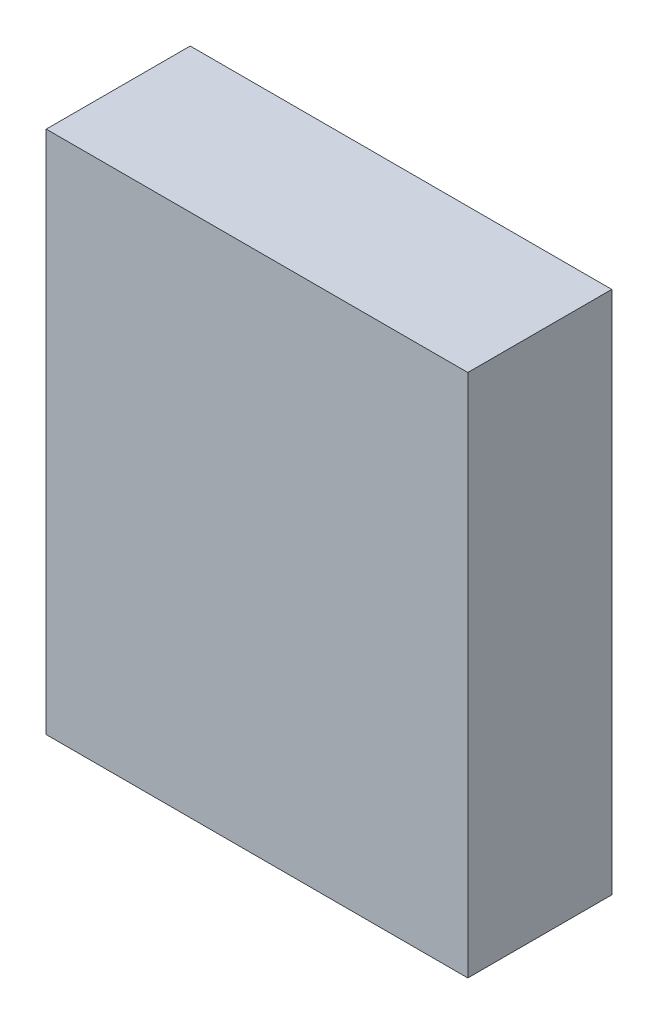
ISO-10303-21;
HEADER;
FILE_DESCRIPTION(('STEP AP214'),'2;1');
FILE_NAME('part.step','',(''),(''),'','','');
FILE_SCHEMA(('AUTOMOTIVE_DESIGN { 1 0 10303 214 1 1 1 1 }'));
ENDSEC;
DATA;
#1=APPLICATION_CONTEXT('core data for automotive mechanical design processes');
#2=APPLICATION_PROTOCOL_DEFINITION('international standard','automotive_design',2000,#1);
#3=PRODUCT_CONTEXT('',#1,'mechanical');
#4=PRODUCT('Part','Part','',(#3));
#5=PRODUCT_RELATED_PRODUCT_CATEGORY('part','',(#4));
#6=PRODUCT_DEFINITION_FORMATION('','',#4);
#7=PRODUCT_DEFINITION_CONTEXT('part definition',#1,'design');
#8=PRODUCT_DEFINITION('design','',#6,#7);
#9=PRODUCT_DEFINITION_SHAPE('','',#8);
#10=(LENGTH_UNIT() NAMED_UNIT(*) SI_UNIT(.MILLI.,.METRE.));
#11=(NAMED_UNIT(*) PLANE_ANGLE_UNIT() SI_UNIT($,.RADIAN.));
#12=(NAMED_UNIT(*) SI_UNIT($,.STERADIAN.) SOLID_ANGLE_UNIT());
#13=UNCERTAINTY_MEASURE_WITH_UNIT(LENGTH_MEASURE(1.E-05),#10,'distance_accuracy_value','');
#14=(GEOMETRIC_REPRESENTATION_CONTEXT(3) GLOBAL_UNCERTAINTY_ASSIGNED_CONTEXT((#13)) GLOBAL_UNIT_ASSIGNED_CONTEXT((#10,
#11,#12)) REPRESENTATION_CONTEXT('',''));
#15=CARTESIAN_POINT('',(0.,0.,0.));
#16=DIRECTION('',(0.,0.,1.));
#17=DIRECTION('',(1.,0.,0.));
#18=AXIS2_PLACEMENT_3D('',#15,#16,#17);
#19=CARTESIAN_POINT('',(205.,-255.,140.));
#20=DIRECTION('',(-1.,0.,0.));
#21=DIRECTION('',(0.,0.,1.));
#22=AXIS2_PLACEMENT_3D('',#19,#20,#21);
#23=PLANE('',#22);
#24=DIRECTION('',(0.,1.,0.));
#25=VECTOR('',#24,1.);
#26=CARTESIAN_POINT('',(205.,-255.,0.));
#27=LINE('',#26,#25);
#28=CARTESIAN_POINT('',(205.,-255.,0.));
#29=VERTEX_POINT('',#28);
#30=CARTESIAN_POINT('',(205.,255.,0.));
#31=VERTEX_POINT('',#30);
#32=EDGE_CURVE('E113',#29,#31,#27,.T.);
#33=ORIENTED_EDGE('',*,*,#32,.T.);
#34=DIRECTION('',(0.,0.,-1.));
#35=VECTOR('',#34,1.);
#36=CARTESIAN_POINT('',(205.,255.,140.));
#37=LINE('',#36,#35);
#38=CARTESIAN_POINT('',(205.,255.,140.));
#39=VERTEX_POINT('',#38);
#40=EDGE_CURVE('E11',#39,#31,#37,.T.);
#41=ORIENTED_EDGE('',*,*,#40,.F.);
#42=DIRECTION('',(0.,1.,0.));
#43=VECTOR('',#42,1.);
#44=CARTESIAN_POINT('',(205.,-255.,140.));
#45=LINE('',#44,#43);
#46=CARTESIAN_POINT('',(205.,-255.,140.));
#47=VERTEX_POINT('',#46);
#48=EDGE_CURVE('E97',#47,#39,#45,.T.);
#49=ORIENTED_EDGE('',*,*,#48,.F.);
#50=DIRECTION('',(0.,0.,-1.));
#51=VECTOR('',#50,1.);
#52=CARTESIAN_POINT('',(205.,-255.,140.));
#53=LINE('',#52,#51);
#54=EDGE_CURVE('E109',#47,#29,#53,.T.);
#55=ORIENTED_EDGE('',*,*,#54,.T.);
#56=EDGE_LOOP('',(#33,#41,#49,#55));
#57=FACE_BOUND('',#56,.T.);
#58=ADVANCED_FACE('F45',(#57),#23,.F.);
#59=CARTESIAN_POINT('',(-205.,255.,140.));
#60=DIRECTION('',(0.,-1.,0.));
#61=DIRECTION('',(0.,0.,-1.));
#62=AXIS2_PLACEMENT_3D('',#59,#60,#61);
#63=PLANE('',#62);
#64=DIRECTION('',(-1.,0.,0.));
#65=VECTOR('',#64,1.);
#66=CARTESIAN_POINT('',(-205.,255.,0.));
#67=LINE('',#66,#65);
#68=CARTESIAN_POINT('',(-205.,255.,0.));
#69=VERTEX_POINT('',#68);
#70=EDGE_CURVE('E102',#31,#69,#67,.T.);
#71=ORIENTED_EDGE('',*,*,#70,.T.);
#72=DIRECTION('',(0.,0.,-1.));
#73=VECTOR('',#72,1.);
#74=CARTESIAN_POINT('',(-205.,255.,140.));
#75=LINE('',#74,#73);
#76=CARTESIAN_POINT('',(-205.,255.,140.));
#77=VERTEX_POINT('',#76);
#78=EDGE_CURVE('E54',#77,#69,#75,.T.);
#79=ORIENTED_EDGE('',*,*,#78,.F.);
#80=DIRECTION('',(-1.,0.,0.));
#81=VECTOR('',#80,1.);
#82=CARTESIAN_POINT('',(-205.,255.,140.));
#83=LINE('',#82,#81);
#84=EDGE_CURVE('E92',#39,#77,#83,.T.);
#85=ORIENTED_EDGE('',*,*,#84,.F.);
#86=ORIENTED_EDGE('',*,*,#40,.T.);
#87=EDGE_LOOP('',(#71,#79,#85,#86));
#88=FACE_BOUND('',#87,.T.);
#89=ADVANCED_FACE('F101',(#88),#63,.F.);
#90=CARTESIAN_POINT('',(-205.,-255.,140.));
#91=DIRECTION('',(1.,0.,0.));
#92=DIRECTION('',(0.,0.,-1.));
#93=AXIS2_PLACEMENT_3D('',#90,#91,#92);
#94=PLANE('',#93);
#95=DIRECTION('',(0.,-1.,0.));
#96=VECTOR('',#95,1.);
#97=CARTESIAN_POINT('',(-205.,-255.,0.));
#98=LINE('',#97,#96);
#99=CARTESIAN_POINT('',(-205.,-255.,0.));
#100=VERTEX_POINT('',#99);
#101=EDGE_CURVE('E79',#69,#100,#98,.T.);
#102=ORIENTED_EDGE('',*,*,#101,.T.);
#103=DIRECTION('',(0.,0.,-1.));
#104=VECTOR('',#103,1.);
#105=CARTESIAN_POINT('',(-205.,-255.,140.));
#106=LINE('',#105,#104);
#107=CARTESIAN_POINT('',(-205.,-255.,140.));
#108=VERTEX_POINT('',#107);
#109=EDGE_CURVE('E104',#108,#100,#106,.T.);
#110=ORIENTED_EDGE('',*,*,#109,.F.);
#111=DIRECTION('',(0.,-1.,0.));
#112=VECTOR('',#111,1.);
#113=CARTESIAN_POINT('',(-205.,-255.,140.));
#114=LINE('',#113,#112);
#115=EDGE_CURVE('E95',#77,#108,#114,.T.);
#116=ORIENTED_EDGE('',*,*,#115,.F.);
#117=ORIENTED_EDGE('',*,*,#78,.T.);
#118=EDGE_LOOP('',(#102,#110,#116,#117));
#119=FACE_BOUND('',#118,.T.);
#120=ADVANCED_FACE('F105',(#119),#94,.F.);
#121=CARTESIAN_POINT('',(-205.,-255.,140.));
#122=DIRECTION('',(0.,1.,0.));
#123=DIRECTION('',(0.,0.,1.));
#124=AXIS2_PLACEMENT_3D('',#121,#122,#123);
#125=PLANE('',#124);
#126=DIRECTION('',(1.,0.,0.));
#127=VECTOR('',#126,1.);
#128=CARTESIAN_POINT('',(-205.,-255.,0.));
#129=LINE('',#128,#127);
#130=EDGE_CURVE('E85',#100,#29,#129,.T.);
#131=ORIENTED_EDGE('',*,*,#130,.T.);
#132=ORIENTED_EDGE('',*,*,#54,.F.);
#133=DIRECTION('',(1.,0.,0.));
#134=VECTOR('',#133,1.);
#135=CARTESIAN_POINT('',(-205.,-255.,140.));
#136=LINE('',#135,#134);
#137=EDGE_CURVE('E62',#108,#47,#136,.T.);
#138=ORIENTED_EDGE('',*,*,#137,.F.);
#139=ORIENTED_EDGE('',*,*,#109,.T.);
#140=EDGE_LOOP('',(#131,#132,#138,#139));
#141=FACE_BOUND('',#140,.T.);
#142=ADVANCED_FACE('F126',(#141),#125,.F.);
#143=CARTESIAN_POINT('',(0.,0.,140.));
#144=DIRECTION('',(0.,0.,-1.));
#145=DIRECTION('',(-1.,0.,0.));
#146=AXIS2_PLACEMENT_3D('',#143,#144,#145);
#147=PLANE('',#146);
#148=ORIENTED_EDGE('',*,*,#48,.T.);
#149=ORIENTED_EDGE('',*,*,#84,.T.);
#150=ORIENTED_EDGE('',*,*,#115,.T.);
#151=ORIENTED_EDGE('',*,*,#137,.T.);
#152=EDGE_LOOP('',(#148,#149,#150,#151));
#153=FACE_BOUND('',#152,.T.);
#154=ADVANCED_FACE('F93',(#153),#147,.F.);
#155=CARTESIAN_POINT('',(0.,0.,0.));
#156=DIRECTION('',(0.,0.,-1.));
#157=DIRECTION('',(-1.,0.,0.));
#158=AXIS2_PLACEMENT_3D('',#155,#156,#157);
#159=PLANE('',#158);
#160=ORIENTED_EDGE('',*,*,#32,.F.);
#161=ORIENTED_EDGE('',*,*,#130,.F.);
#162=ORIENTED_EDGE('',*,*,#101,.F.);
#163=ORIENTED_EDGE('',*,*,#70,.F.);
#164=EDGE_LOOP('',(#160,#161,#162,#163));
#165=FACE_BOUND('',#164,.T.);
#166=ADVANCED_FACE('F129',(#165),#159,.T.);
#167=CLOSED_SHELL('',(#58,#89,#120,#142,#154,#166));
#168=MANIFOLD_SOLID_BREP('B2',#167);
#169=ADVANCED_BREP_SHAPE_REPRESENTATION('',(#18,#168),#14);
#170=SHAPE_DEFINITION_REPRESENTATION(#9,#169);
ENDSEC;
END-ISO-10303-21;
